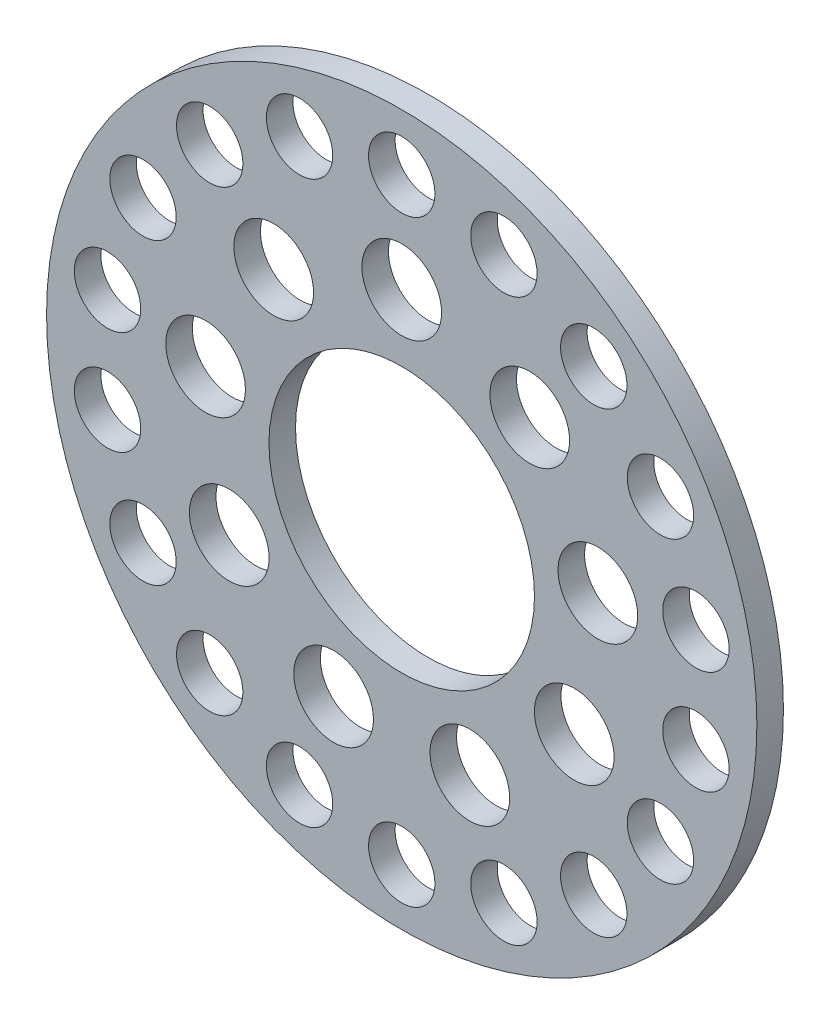
ISO-10303-21;
HEADER;
FILE_DESCRIPTION(('STEP AP214'),'2;1');
FILE_NAME('part.step','',(''),(''),'','','');
FILE_SCHEMA(('AUTOMOTIVE_DESIGN { 1 0 10303 214 1 1 1 1 }'));
ENDSEC;
DATA;
#1=APPLICATION_CONTEXT('core data for automotive mechanical design processes');
#2=APPLICATION_PROTOCOL_DEFINITION('international standard','automotive_design',2000,#1);
#3=PRODUCT_CONTEXT('',#1,'mechanical');
#4=PRODUCT('Part','Part','',(#3));
#5=PRODUCT_RELATED_PRODUCT_CATEGORY('part','',(#4));
#6=PRODUCT_DEFINITION_FORMATION('','',#4);
#7=PRODUCT_DEFINITION_CONTEXT('part definition',#1,'design');
#8=PRODUCT_DEFINITION('design','',#6,#7);
#9=PRODUCT_DEFINITION_SHAPE('','',#8);
#10=(LENGTH_UNIT() NAMED_UNIT(*) SI_UNIT(.MILLI.,.METRE.));
#11=(NAMED_UNIT(*) PLANE_ANGLE_UNIT() SI_UNIT($,.RADIAN.));
#12=(NAMED_UNIT(*) SI_UNIT($,.STERADIAN.) SOLID_ANGLE_UNIT());
#13=UNCERTAINTY_MEASURE_WITH_UNIT(LENGTH_MEASURE(1.E-05),#10,'distance_accuracy_value','');
#14=(GEOMETRIC_REPRESENTATION_CONTEXT(3) GLOBAL_UNCERTAINTY_ASSIGNED_CONTEXT((#13)) GLOBAL_UNIT_ASSIGNED_CONTEXT((#10,
#11,#12)) REPRESENTATION_CONTEXT('',''));
#15=CARTESIAN_POINT('',(0.,0.,0.));
#16=DIRECTION('',(0.,0.,1.));
#17=DIRECTION('',(1.,0.,0.));
#18=AXIS2_PLACEMENT_3D('',#15,#16,#17);
#19=CARTESIAN_POINT('',(0.,0.,2.));
#20=DIRECTION('',(0.,0.,1.));
#21=DIRECTION('',(1.,0.,0.));
#22=AXIS2_PLACEMENT_3D('',#19,#20,#21);
#23=PLANE('',#22);
#24=CARTESIAN_POINT('',(-14.7721162951824,2.60472266500311,2.));
#25=DIRECTION('',(0.,0.,1.));
#26=DIRECTION('',(1.,0.,0.));
#27=AXIS2_PLACEMENT_3D('',#24,#25,#26);
#28=CIRCLE('',#27,3.);
#29=CARTESIAN_POINT('',(-11.7721162951824,2.60472266500311,2.));
#30=VERTEX_POINT('',#29);
#31=EDGE_CURVE('E197',#30,#30,#28,.T.);
#32=ORIENTED_EDGE('',*,*,#31,.F.);
#33=EDGE_LOOP('',(#32));
#34=FACE_BOUND('',#33,.T.);
#35=CARTESIAN_POINT('',(-5.13030214988338,-14.0953893117889,2.));
#36=DIRECTION('',(0.,0.,1.));
#37=DIRECTION('',(1.,0.,0.));
#38=AXIS2_PLACEMENT_3D('',#35,#36,#37);
#39=CIRCLE('',#38,3.);
#40=CARTESIAN_POINT('',(-2.13030214988338,-14.0953893117889,2.));
#41=VERTEX_POINT('',#40);
#42=EDGE_CURVE('E185',#41,#41,#39,.T.);
#43=ORIENTED_EDGE('',*,*,#42,.F.);
#44=EDGE_LOOP('',(#43));
#45=FACE_BOUND('',#44,.T.);
#46=CARTESIAN_POINT('',(12.9903810567679,-7.49999999999926,2.));
#47=DIRECTION('',(0.,0.,1.));
#48=DIRECTION('',(1.,0.,0.));
#49=AXIS2_PLACEMENT_3D('',#46,#47,#48);
#50=CIRCLE('',#49,3.);
#51=CARTESIAN_POINT('',(15.9903810567679,-7.49999999999926,2.));
#52=VERTEX_POINT('',#51);
#53=EDGE_CURVE('E173',#52,#52,#50,.T.);
#54=ORIENTED_EDGE('',*,*,#53,.F.);
#55=EDGE_LOOP('',(#54));
#56=FACE_BOUND('',#55,.T.);
#57=CARTESIAN_POINT('',(9.64181414529811,11.4906666467847,2.));
#58=DIRECTION('',(0.,0.,1.));
#59=DIRECTION('',(1.,0.,0.));
#60=AXIS2_PLACEMENT_3D('',#57,#58,#59);
#61=CIRCLE('',#60,3.);
#62=CARTESIAN_POINT('',(12.6418141452981,11.4906666467847,2.));
#63=VERTEX_POINT('',#62);
#64=EDGE_CURVE('E161',#63,#63,#61,.T.);
#65=ORIENTED_EDGE('',*,*,#64,.F.);
#66=EDGE_LOOP('',(#65));
#67=FACE_BOUND('',#66,.T.);
#68=CARTESIAN_POINT('',(-14.4627212179467,17.2359999701758,2.));
#69=DIRECTION('',(0.,0.,1.));
#70=DIRECTION('',(1.,0.,0.));
#71=AXIS2_PLACEMENT_3D('',#68,#69,#70);
#72=CIRCLE('',#71,2.50000000000106);
#73=CARTESIAN_POINT('',(-11.9627212179456,17.2359999701758,2.));
#74=VERTEX_POINT('',#73);
#75=EDGE_CURVE('E149',#74,#74,#72,.T.);
#76=ORIENTED_EDGE('',*,*,#75,.F.);
#77=EDGE_LOOP('',(#76));
#78=FACE_BOUND('',#77,.T.);
#79=CARTESIAN_POINT('',(-22.1581744427731,3.90708399750404,2.));
#80=DIRECTION('',(0.,0.,1.));
#81=DIRECTION('',(1.,0.,0.));
#82=AXIS2_PLACEMENT_3D('',#79,#80,#81);
#83=CIRCLE('',#82,2.50000000000229);
#84=CARTESIAN_POINT('',(-19.6581744427708,3.90708399750404,2.));
#85=VERTEX_POINT('',#84);
#86=EDGE_CURVE('E137',#85,#85,#83,.T.);
#87=ORIENTED_EDGE('',*,*,#86,.F.);
#88=EDGE_LOOP('',(#87));
#89=FACE_BOUND('',#88,.T.);
#90=CARTESIAN_POINT('',(-19.485571585147,-11.2500000000017,2.));
#91=DIRECTION('',(0.,0.,1.));
#92=DIRECTION('',(1.,0.,0.));
#93=AXIS2_PLACEMENT_3D('',#90,#91,#92);
#94=CIRCLE('',#93,2.50000000000345);
#95=CARTESIAN_POINT('',(-16.9855715851435,-11.2500000000017,2.));
#96=VERTEX_POINT('',#95);
#97=EDGE_CURVE('E125',#96,#96,#94,.T.);
#98=ORIENTED_EDGE('',*,*,#97,.F.);
#99=EDGE_LOOP('',(#98));
#100=FACE_BOUND('',#99,.T.);
#101=CARTESIAN_POINT('',(-7.69545322482383,-21.1430839676836,2.));
#102=DIRECTION('',(0.,0.,1.));
#103=DIRECTION('',(1.,0.,0.));
#104=AXIS2_PLACEMENT_3D('',#101,#102,#103);
#105=CIRCLE('',#104,2.50000000000391);
#106=CARTESIAN_POINT('',(-5.19545322481992,-21.1430839676836,2.));
#107=VERTEX_POINT('',#106);
#108=EDGE_CURVE('E113',#107,#107,#105,.T.);
#109=ORIENTED_EDGE('',*,*,#108,.F.);
#110=EDGE_LOOP('',(#109));
#111=FACE_BOUND('',#110,.T.);
#112=CARTESIAN_POINT('',(7.69545322483126,-21.1430839676823,2.));
#113=DIRECTION('',(0.,0.,1.));
#114=DIRECTION('',(1.,0.,0.));
#115=AXIS2_PLACEMENT_3D('',#112,#113,#114);
#116=CIRCLE('',#115,2.50000000000349);
#117=CARTESIAN_POINT('',(10.1954532248348,-21.1430839676823,2.));
#118=VERTEX_POINT('',#117);
#119=EDGE_CURVE('E101',#118,#118,#116,.T.);
#120=ORIENTED_EDGE('',*,*,#119,.F.);
#121=EDGE_LOOP('',(#120));
#122=FACE_BOUND('',#121,.T.);
#123=CARTESIAN_POINT('',(19.4855715851527,-11.2499999999983,2.));
#124=DIRECTION('',(0.,0.,1.));
#125=DIRECTION('',(1.,0.,0.));
#126=AXIS2_PLACEMENT_3D('',#123,#124,#125);
#127=CIRCLE('',#126,2.50000000000237);
#128=CARTESIAN_POINT('',(21.9855715851551,-11.2499999999983,2.));
#129=VERTEX_POINT('',#128);
#130=EDGE_CURVE('E89',#129,#129,#127,.T.);
#131=ORIENTED_EDGE('',*,*,#130,.F.);
#132=EDGE_LOOP('',(#131));
#133=FACE_BOUND('',#132,.T.);
#134=CARTESIAN_POINT('',(22.1581744427763,3.90708399750782,2.));
#135=DIRECTION('',(0.,0.,1.));
#136=DIRECTION('',(1.,0.,0.));
#137=AXIS2_PLACEMENT_3D('',#134,#135,#136);
#138=CIRCLE('',#137,2.50000000000103);
#139=CARTESIAN_POINT('',(24.6581744427773,3.90708399750782,2.));
#140=VERTEX_POINT('',#139);
#141=EDGE_CURVE('E77',#140,#140,#138,.T.);
#142=ORIENTED_EDGE('',*,*,#141,.F.);
#143=EDGE_LOOP('',(#142));
#144=FACE_BOUND('',#143,.T.);
#145=CARTESIAN_POINT('',(14.4627212179476,17.2359999701782,2.));
#146=DIRECTION('',(0.,0.,1.));
#147=DIRECTION('',(1.,0.,0.));
#148=AXIS2_PLACEMENT_3D('',#145,#146,#147);
#149=CIRCLE('',#148,2.5000000000001);
#150=CARTESIAN_POINT('',(16.9627212179477,17.2359999701782,2.));
#151=VERTEX_POINT('',#150);
#152=EDGE_CURVE('E65',#151,#151,#149,.T.);
#153=ORIENTED_EDGE('',*,*,#152,.F.);
#154=EDGE_LOOP('',(#153));
#155=FACE_BOUND('',#154,.T.);
#156=CARTESIAN_POINT('',(0.,15.,2.));
#157=DIRECTION('',(0.,0.,1.));
#158=DIRECTION('',(1.,0.,0.));
#159=AXIS2_PLACEMENT_3D('',#156,#157,#158);
#160=CIRCLE('',#159,3.);
#161=CARTESIAN_POINT('',(3.,15.,2.));
#162=VERTEX_POINT('',#161);
#163=EDGE_CURVE('E53',#162,#162,#160,.T.);
#164=ORIENTED_EDGE('',*,*,#163,.F.);
#165=EDGE_LOOP('',(#164));
#166=FACE_BOUND('',#165,.T.);
#167=CARTESIAN_POINT('',(0.,0.,2.));
#168=DIRECTION('',(0.,0.,1.));
#169=DIRECTION('',(1.,0.,0.));
#170=AXIS2_PLACEMENT_3D('',#167,#168,#169);
#171=CIRCLE('',#170,10.);
#172=CARTESIAN_POINT('',(10.,0.,2.));
#173=VERTEX_POINT('',#172);
#174=EDGE_CURVE('E42',#173,#173,#171,.T.);
#175=ORIENTED_EDGE('',*,*,#174,.F.);
#176=EDGE_LOOP('',(#175));
#177=FACE_BOUND('',#176,.T.);
#178=CARTESIAN_POINT('',(0.,0.,2.));
#179=DIRECTION('',(0.,0.,1.));
#180=DIRECTION('',(1.,0.,0.));
#181=AXIS2_PLACEMENT_3D('',#178,#179,#180);
#182=CIRCLE('',#181,26.75);
#183=CARTESIAN_POINT('',(26.75,0.,2.));
#184=VERTEX_POINT('',#183);
#185=EDGE_CURVE('E10',#184,#184,#182,.T.);
#186=ORIENTED_EDGE('',*,*,#185,.T.);
#187=EDGE_LOOP('',(#186));
#188=FACE_BOUND('',#187,.T.);
#189=CARTESIAN_POINT('',(0.,22.5,2.));
#190=DIRECTION('',(0.,0.,1.));
#191=DIRECTION('',(1.,0.,0.));
#192=AXIS2_PLACEMENT_3D('',#189,#190,#191);
#193=CIRCLE('',#192,2.5);
#194=CARTESIAN_POINT('',(2.5,22.5,2.));
#195=VERTEX_POINT('',#194);
#196=EDGE_CURVE('E47',#195,#195,#193,.T.);
#197=ORIENTED_EDGE('',*,*,#196,.F.);
#198=EDGE_LOOP('',(#197));
#199=FACE_BOUND('',#198,.T.);
#200=CARTESIAN_POINT('',(7.69545322482765,21.1430839676836,2.));
#201=DIRECTION('',(0.,0.,1.));
#202=DIRECTION('',(1.,0.,0.));
#203=AXIS2_PLACEMENT_3D('',#200,#201,#202);
#204=CIRCLE('',#203,2.49999999999995);
#205=CARTESIAN_POINT('',(10.1954532248276,21.1430839676836,2.));
#206=VERTEX_POINT('',#205);
#207=EDGE_CURVE('E59',#206,#206,#204,.T.);
#208=ORIENTED_EDGE('',*,*,#207,.F.);
#209=EDGE_LOOP('',(#208));
#210=FACE_BOUND('',#209,.T.);
#211=CARTESIAN_POINT('',(19.4855715851508,11.2500000000017,2.));
#212=DIRECTION('',(0.,0.,1.));
#213=DIRECTION('',(1.,0.,0.));
#214=AXIS2_PLACEMENT_3D('',#211,#212,#213);
#215=CIRCLE('',#214,2.50000000000048);
#216=CARTESIAN_POINT('',(21.9855715851513,11.2500000000017,2.));
#217=VERTEX_POINT('',#216);
#218=EDGE_CURVE('E71',#217,#217,#215,.T.);
#219=ORIENTED_EDGE('',*,*,#218,.F.);
#220=EDGE_LOOP('',(#219));
#221=FACE_BOUND('',#220,.T.);
#222=CARTESIAN_POINT('',(22.1581744427769,-3.90708399750405,2.));
#223=DIRECTION('',(0.,0.,1.));
#224=DIRECTION('',(1.,0.,0.));
#225=AXIS2_PLACEMENT_3D('',#222,#223,#224);
#226=CIRCLE('',#225,2.50000000000168);
#227=CARTESIAN_POINT('',(24.6581744427786,-3.90708399750405,2.));
#228=VERTEX_POINT('',#227);
#229=EDGE_CURVE('E83',#228,#228,#226,.T.);
#230=ORIENTED_EDGE('',*,*,#229,.F.);
#231=EDGE_LOOP('',(#230));
#232=FACE_BOUND('',#231,.T.);
#233=CARTESIAN_POINT('',(14.4627212179505,-17.2359999701758,2.));
#234=DIRECTION('',(0.,0.,1.));
#235=DIRECTION('',(1.,0.,0.));
#236=AXIS2_PLACEMENT_3D('',#233,#234,#235);
#237=CIRCLE('',#236,2.50000000000299);
#238=CARTESIAN_POINT('',(16.9627212179535,-17.2359999701758,2.));
#239=VERTEX_POINT('',#238);
#240=EDGE_CURVE('E95',#239,#239,#237,.T.);
#241=ORIENTED_EDGE('',*,*,#240,.F.);
#242=EDGE_LOOP('',(#241));
#243=FACE_BOUND('',#242,.T.);
#244=CARTESIAN_POINT('',(3.83141986250838E-12,-22.5,2.));
#245=DIRECTION('',(0.,0.,1.));
#246=DIRECTION('',(1.,0.,0.));
#247=AXIS2_PLACEMENT_3D('',#244,#245,#246);
#248=CIRCLE('',#247,2.50000000000381);
#249=CARTESIAN_POINT('',(2.50000000000765,-22.5,2.));
#250=VERTEX_POINT('',#249);
#251=EDGE_CURVE('E107',#250,#250,#248,.T.);
#252=ORIENTED_EDGE('',*,*,#251,.F.);
#253=EDGE_LOOP('',(#252));
#254=FACE_BOUND('',#253,.T.);
#255=CARTESIAN_POINT('',(-14.4627212179438,-17.2359999701782,2.));
#256=DIRECTION('',(0.,0.,1.));
#257=DIRECTION('',(1.,0.,0.));
#258=AXIS2_PLACEMENT_3D('',#255,#256,#257);
#259=CIRCLE('',#258,2.50000000000377);
#260=CARTESIAN_POINT('',(-11.96272121794,-17.2359999701782,2.));
#261=VERTEX_POINT('',#260);
#262=EDGE_CURVE('E119',#261,#261,#259,.T.);
#263=ORIENTED_EDGE('',*,*,#262,.F.);
#264=EDGE_LOOP('',(#263));
#265=FACE_BOUND('',#264,.T.);
#266=CARTESIAN_POINT('',(-22.1581744427724,-3.90708399750782,2.));
#267=DIRECTION('',(0.,0.,1.));
#268=DIRECTION('',(1.,0.,0.));
#269=AXIS2_PLACEMENT_3D('',#266,#267,#268);
#270=CIRCLE('',#269,2.50000000000291);
#271=CARTESIAN_POINT('',(-19.6581744427695,-3.90708399750782,2.));
#272=VERTEX_POINT('',#271);
#273=EDGE_CURVE('E131',#272,#272,#270,.T.);
#274=ORIENTED_EDGE('',*,*,#273,.F.);
#275=EDGE_LOOP('',(#274));
#276=FACE_BOUND('',#275,.T.);
#277=CARTESIAN_POINT('',(-19.4855715851489,11.2499999999983,2.));
#278=DIRECTION('',(0.,0.,1.));
#279=DIRECTION('',(1.,0.,0.));
#280=AXIS2_PLACEMENT_3D('',#277,#278,#279);
#281=CIRCLE('',#280,2.50000000000165);
#282=CARTESIAN_POINT('',(-16.9855715851473,11.2499999999983,2.));
#283=VERTEX_POINT('',#282);
#284=EDGE_CURVE('E143',#283,#283,#281,.T.);
#285=ORIENTED_EDGE('',*,*,#284,.F.);
#286=EDGE_LOOP('',(#285));
#287=FACE_BOUND('',#286,.T.);
#288=CARTESIAN_POINT('',(-7.69545322482745,21.1430839676823,2.));
#289=DIRECTION('',(0.,0.,1.));
#290=DIRECTION('',(1.,0.,0.));
#291=AXIS2_PLACEMENT_3D('',#288,#289,#290);
#292=CIRCLE('',#291,2.50000000000059);
#293=CARTESIAN_POINT('',(-5.19545322482686,21.1430839676823,2.));
#294=VERTEX_POINT('',#293);
#295=EDGE_CURVE('E155',#294,#294,#292,.T.);
#296=ORIENTED_EDGE('',*,*,#295,.F.);
#297=EDGE_LOOP('',(#296));
#298=FACE_BOUND('',#297,.T.);
#299=CARTESIAN_POINT('',(14.7721162951838,2.60472266500479,2.));
#300=DIRECTION('',(0.,0.,1.));
#301=DIRECTION('',(1.,0.,0.));
#302=AXIS2_PLACEMENT_3D('',#299,#300,#301);
#303=CIRCLE('',#302,3.);
#304=CARTESIAN_POINT('',(17.7721162951838,2.60472266500479,2.));
#305=VERTEX_POINT('',#304);
#306=EDGE_CURVE('E167',#305,#305,#303,.T.);
#307=ORIENTED_EDGE('',*,*,#306,.F.);
#308=EDGE_LOOP('',(#307));
#309=FACE_BOUND('',#308,.T.);
#310=CARTESIAN_POINT('',(5.13030214988668,-14.0953893117883,2.));
#311=DIRECTION('',(0.,0.,1.));
#312=DIRECTION('',(1.,0.,0.));
#313=AXIS2_PLACEMENT_3D('',#310,#311,#312);
#314=CIRCLE('',#313,3.);
#315=CARTESIAN_POINT('',(8.13030214988668,-14.0953893117883,2.));
#316=VERTEX_POINT('',#315);
#317=EDGE_CURVE('E179',#316,#316,#314,.T.);
#318=ORIENTED_EDGE('',*,*,#317,.F.);
#319=EDGE_LOOP('',(#318));
#320=FACE_BOUND('',#319,.T.);
#321=CARTESIAN_POINT('',(-12.9903810567653,-7.50000000000074,2.));
#322=DIRECTION('',(0.,0.,1.));
#323=DIRECTION('',(1.,0.,0.));
#324=AXIS2_PLACEMENT_3D('',#321,#322,#323);
#325=CIRCLE('',#324,3.);
#326=CARTESIAN_POINT('',(-9.9903810567653,-7.50000000000074,2.));
#327=VERTEX_POINT('',#326);
#328=EDGE_CURVE('E191',#327,#327,#325,.T.);
#329=ORIENTED_EDGE('',*,*,#328,.F.);
#330=EDGE_LOOP('',(#329));
#331=FACE_BOUND('',#330,.T.);
#332=CARTESIAN_POINT('',(-9.64181414529789,11.4906666467841,2.));
#333=DIRECTION('',(0.,0.,1.));
#334=DIRECTION('',(1.,0.,0.));
#335=AXIS2_PLACEMENT_3D('',#332,#333,#334);
#336=CIRCLE('',#335,3.);
#337=CARTESIAN_POINT('',(-6.64181414529789,11.4906666467841,2.));
#338=VERTEX_POINT('',#337);
#339=EDGE_CURVE('E203',#338,#338,#336,.T.);
#340=ORIENTED_EDGE('',*,*,#339,.F.);
#341=EDGE_LOOP('',(#340));
#342=FACE_BOUND('',#341,.T.);
#343=ADVANCED_FACE('F31',(#34,#45,#56,#67,#78,#89,#100,#111,#122,#133,#144,#155,#166,#177,#188,
#199,#210,#221,#232,#243,#254,#265,#276,#287,#298,#309,#320,#331,#342),#23,.T.);
#344=CARTESIAN_POINT('',(0.,0.,0.));
#345=DIRECTION('',(0.,0.,1.));
#346=DIRECTION('',(1.,0.,0.));
#347=AXIS2_PLACEMENT_3D('',#344,#345,#346);
#348=PLANE('',#347);
#349=CARTESIAN_POINT('',(0.,0.,0.));
#350=DIRECTION('',(0.,0.,1.));
#351=DIRECTION('',(1.,0.,0.));
#352=AXIS2_PLACEMENT_3D('',#349,#350,#351);
#353=CIRCLE('',#352,26.75);
#354=CARTESIAN_POINT('',(26.75,0.,0.));
#355=VERTEX_POINT('',#354);
#356=EDGE_CURVE('E35',#355,#355,#353,.T.);
#357=ORIENTED_EDGE('',*,*,#356,.F.);
#358=EDGE_LOOP('',(#357));
#359=FACE_BOUND('',#358,.T.);
#360=CARTESIAN_POINT('',(0.,0.,0.));
#361=DIRECTION('',(0.,0.,1.));
#362=DIRECTION('',(1.,0.,0.));
#363=AXIS2_PLACEMENT_3D('',#360,#361,#362);
#364=CIRCLE('',#363,10.);
#365=CARTESIAN_POINT('',(10.,0.,0.));
#366=VERTEX_POINT('',#365);
#367=EDGE_CURVE('E44',#366,#366,#364,.T.);
#368=ORIENTED_EDGE('',*,*,#367,.T.);
#369=EDGE_LOOP('',(#368));
#370=FACE_BOUND('',#369,.T.);
#371=CARTESIAN_POINT('',(0.,22.5,0.));
#372=DIRECTION('',(0.,0.,1.));
#373=DIRECTION('',(1.,0.,0.));
#374=AXIS2_PLACEMENT_3D('',#371,#372,#373);
#375=CIRCLE('',#374,2.5);
#376=CARTESIAN_POINT('',(2.5,22.5,0.));
#377=VERTEX_POINT('',#376);
#378=EDGE_CURVE('E50',#377,#377,#375,.T.);
#379=ORIENTED_EDGE('',*,*,#378,.T.);
#380=EDGE_LOOP('',(#379));
#381=FACE_BOUND('',#380,.T.);
#382=CARTESIAN_POINT('',(0.,15.,0.));
#383=DIRECTION('',(0.,0.,1.));
#384=DIRECTION('',(1.,0.,0.));
#385=AXIS2_PLACEMENT_3D('',#382,#383,#384);
#386=CIRCLE('',#385,3.);
#387=CARTESIAN_POINT('',(3.,15.,0.));
#388=VERTEX_POINT('',#387);
#389=EDGE_CURVE('E56',#388,#388,#386,.T.);
#390=ORIENTED_EDGE('',*,*,#389,.T.);
#391=EDGE_LOOP('',(#390));
#392=FACE_BOUND('',#391,.T.);
#393=CARTESIAN_POINT('',(7.69545322482765,21.1430839676836,0.));
#394=DIRECTION('',(0.,0.,1.));
#395=DIRECTION('',(1.,0.,0.));
#396=AXIS2_PLACEMENT_3D('',#393,#394,#395);
#397=CIRCLE('',#396,2.49999999999995);
#398=CARTESIAN_POINT('',(10.1954532248276,21.1430839676836,0.));
#399=VERTEX_POINT('',#398);
#400=EDGE_CURVE('E62',#399,#399,#397,.T.);
#401=ORIENTED_EDGE('',*,*,#400,.T.);
#402=EDGE_LOOP('',(#401));
#403=FACE_BOUND('',#402,.T.);
#404=CARTESIAN_POINT('',(14.4627212179476,17.2359999701782,0.));
#405=DIRECTION('',(0.,0.,1.));
#406=DIRECTION('',(1.,0.,0.));
#407=AXIS2_PLACEMENT_3D('',#404,#405,#406);
#408=CIRCLE('',#407,2.5000000000001);
#409=CARTESIAN_POINT('',(16.9627212179477,17.2359999701782,0.));
#410=VERTEX_POINT('',#409);
#411=EDGE_CURVE('E68',#410,#410,#408,.T.);
#412=ORIENTED_EDGE('',*,*,#411,.T.);
#413=EDGE_LOOP('',(#412));
#414=FACE_BOUND('',#413,.T.);
#415=CARTESIAN_POINT('',(19.4855715851508,11.2500000000017,0.));
#416=DIRECTION('',(0.,0.,1.));
#417=DIRECTION('',(1.,0.,0.));
#418=AXIS2_PLACEMENT_3D('',#415,#416,#417);
#419=CIRCLE('',#418,2.50000000000048);
#420=CARTESIAN_POINT('',(21.9855715851513,11.2500000000017,0.));
#421=VERTEX_POINT('',#420);
#422=EDGE_CURVE('E74',#421,#421,#419,.T.);
#423=ORIENTED_EDGE('',*,*,#422,.T.);
#424=EDGE_LOOP('',(#423));
#425=FACE_BOUND('',#424,.T.);
#426=CARTESIAN_POINT('',(22.1581744427763,3.90708399750782,0.));
#427=DIRECTION('',(0.,0.,1.));
#428=DIRECTION('',(1.,0.,0.));
#429=AXIS2_PLACEMENT_3D('',#426,#427,#428);
#430=CIRCLE('',#429,2.50000000000103);
#431=CARTESIAN_POINT('',(24.6581744427773,3.90708399750782,0.));
#432=VERTEX_POINT('',#431);
#433=EDGE_CURVE('E80',#432,#432,#430,.T.);
#434=ORIENTED_EDGE('',*,*,#433,.T.);
#435=EDGE_LOOP('',(#434));
#436=FACE_BOUND('',#435,.T.);
#437=CARTESIAN_POINT('',(22.1581744427769,-3.90708399750405,0.));
#438=DIRECTION('',(0.,0.,1.));
#439=DIRECTION('',(1.,0.,0.));
#440=AXIS2_PLACEMENT_3D('',#437,#438,#439);
#441=CIRCLE('',#440,2.50000000000168);
#442=CARTESIAN_POINT('',(24.6581744427786,-3.90708399750405,0.));
#443=VERTEX_POINT('',#442);
#444=EDGE_CURVE('E86',#443,#443,#441,.T.);
#445=ORIENTED_EDGE('',*,*,#444,.T.);
#446=EDGE_LOOP('',(#445));
#447=FACE_BOUND('',#446,.T.);
#448=CARTESIAN_POINT('',(19.4855715851527,-11.2499999999983,0.));
#449=DIRECTION('',(0.,0.,1.));
#450=DIRECTION('',(1.,0.,0.));
#451=AXIS2_PLACEMENT_3D('',#448,#449,#450);
#452=CIRCLE('',#451,2.50000000000237);
#453=CARTESIAN_POINT('',(21.9855715851551,-11.2499999999983,0.));
#454=VERTEX_POINT('',#453);
#455=EDGE_CURVE('E92',#454,#454,#452,.T.);
#456=ORIENTED_EDGE('',*,*,#455,.T.);
#457=EDGE_LOOP('',(#456));
#458=FACE_BOUND('',#457,.T.);
#459=CARTESIAN_POINT('',(14.4627212179505,-17.2359999701758,0.));
#460=DIRECTION('',(0.,0.,1.));
#461=DIRECTION('',(1.,0.,0.));
#462=AXIS2_PLACEMENT_3D('',#459,#460,#461);
#463=CIRCLE('',#462,2.50000000000299);
#464=CARTESIAN_POINT('',(16.9627212179535,-17.2359999701758,0.));
#465=VERTEX_POINT('',#464);
#466=EDGE_CURVE('E98',#465,#465,#463,.T.);
#467=ORIENTED_EDGE('',*,*,#466,.T.);
#468=EDGE_LOOP('',(#467));
#469=FACE_BOUND('',#468,.T.);
#470=CARTESIAN_POINT('',(7.69545322483126,-21.1430839676823,0.));
#471=DIRECTION('',(0.,0.,1.));
#472=DIRECTION('',(1.,0.,0.));
#473=AXIS2_PLACEMENT_3D('',#470,#471,#472);
#474=CIRCLE('',#473,2.50000000000349);
#475=CARTESIAN_POINT('',(10.1954532248348,-21.1430839676823,0.));
#476=VERTEX_POINT('',#475);
#477=EDGE_CURVE('E104',#476,#476,#474,.T.);
#478=ORIENTED_EDGE('',*,*,#477,.T.);
#479=EDGE_LOOP('',(#478));
#480=FACE_BOUND('',#479,.T.);
#481=CARTESIAN_POINT('',(3.83141986250838E-12,-22.5,0.));
#482=DIRECTION('',(0.,0.,1.));
#483=DIRECTION('',(1.,0.,0.));
#484=AXIS2_PLACEMENT_3D('',#481,#482,#483);
#485=CIRCLE('',#484,2.50000000000381);
#486=CARTESIAN_POINT('',(2.50000000000765,-22.5,0.));
#487=VERTEX_POINT('',#486);
#488=EDGE_CURVE('E110',#487,#487,#485,.T.);
#489=ORIENTED_EDGE('',*,*,#488,.T.);
#490=EDGE_LOOP('',(#489));
#491=FACE_BOUND('',#490,.T.);
#492=CARTESIAN_POINT('',(-7.69545322482383,-21.1430839676836,0.));
#493=DIRECTION('',(0.,0.,1.));
#494=DIRECTION('',(1.,0.,0.));
#495=AXIS2_PLACEMENT_3D('',#492,#493,#494);
#496=CIRCLE('',#495,2.50000000000391);
#497=CARTESIAN_POINT('',(-5.19545322481992,-21.1430839676836,0.));
#498=VERTEX_POINT('',#497);
#499=EDGE_CURVE('E116',#498,#498,#496,.T.);
#500=ORIENTED_EDGE('',*,*,#499,.T.);
#501=EDGE_LOOP('',(#500));
#502=FACE_BOUND('',#501,.T.);
#503=CARTESIAN_POINT('',(-14.4627212179438,-17.2359999701782,0.));
#504=DIRECTION('',(0.,0.,1.));
#505=DIRECTION('',(1.,0.,0.));
#506=AXIS2_PLACEMENT_3D('',#503,#504,#505);
#507=CIRCLE('',#506,2.50000000000377);
#508=CARTESIAN_POINT('',(-11.96272121794,-17.2359999701782,0.));
#509=VERTEX_POINT('',#508);
#510=EDGE_CURVE('E122',#509,#509,#507,.T.);
#511=ORIENTED_EDGE('',*,*,#510,.T.);
#512=EDGE_LOOP('',(#511));
#513=FACE_BOUND('',#512,.T.);
#514=CARTESIAN_POINT('',(-19.485571585147,-11.2500000000017,0.));
#515=DIRECTION('',(0.,0.,1.));
#516=DIRECTION('',(1.,0.,0.));
#517=AXIS2_PLACEMENT_3D('',#514,#515,#516);
#518=CIRCLE('',#517,2.50000000000345);
#519=CARTESIAN_POINT('',(-16.9855715851435,-11.2500000000017,0.));
#520=VERTEX_POINT('',#519);
#521=EDGE_CURVE('E128',#520,#520,#518,.T.);
#522=ORIENTED_EDGE('',*,*,#521,.T.);
#523=EDGE_LOOP('',(#522));
#524=FACE_BOUND('',#523,.T.);
#525=CARTESIAN_POINT('',(-22.1581744427724,-3.90708399750782,0.));
#526=DIRECTION('',(0.,0.,1.));
#527=DIRECTION('',(1.,0.,0.));
#528=AXIS2_PLACEMENT_3D('',#525,#526,#527);
#529=CIRCLE('',#528,2.50000000000291);
#530=CARTESIAN_POINT('',(-19.6581744427695,-3.90708399750782,0.));
#531=VERTEX_POINT('',#530);
#532=EDGE_CURVE('E134',#531,#531,#529,.T.);
#533=ORIENTED_EDGE('',*,*,#532,.T.);
#534=EDGE_LOOP('',(#533));
#535=FACE_BOUND('',#534,.T.);
#536=CARTESIAN_POINT('',(-22.1581744427731,3.90708399750404,0.));
#537=DIRECTION('',(0.,0.,1.));
#538=DIRECTION('',(1.,0.,0.));
#539=AXIS2_PLACEMENT_3D('',#536,#537,#538);
#540=CIRCLE('',#539,2.50000000000229);
#541=CARTESIAN_POINT('',(-19.6581744427708,3.90708399750404,0.));
#542=VERTEX_POINT('',#541);
#543=EDGE_CURVE('E140',#542,#542,#540,.T.);
#544=ORIENTED_EDGE('',*,*,#543,.T.);
#545=EDGE_LOOP('',(#544));
#546=FACE_BOUND('',#545,.T.);
#547=CARTESIAN_POINT('',(-19.4855715851489,11.2499999999983,0.));
#548=DIRECTION('',(0.,0.,1.));
#549=DIRECTION('',(1.,0.,0.));
#550=AXIS2_PLACEMENT_3D('',#547,#548,#549);
#551=CIRCLE('',#550,2.50000000000165);
#552=CARTESIAN_POINT('',(-16.9855715851473,11.2499999999983,0.));
#553=VERTEX_POINT('',#552);
#554=EDGE_CURVE('E146',#553,#553,#551,.T.);
#555=ORIENTED_EDGE('',*,*,#554,.T.);
#556=EDGE_LOOP('',(#555));
#557=FACE_BOUND('',#556,.T.);
#558=CARTESIAN_POINT('',(-14.4627212179467,17.2359999701758,0.));
#559=DIRECTION('',(0.,0.,1.));
#560=DIRECTION('',(1.,0.,0.));
#561=AXIS2_PLACEMENT_3D('',#558,#559,#560);
#562=CIRCLE('',#561,2.50000000000106);
#563=CARTESIAN_POINT('',(-11.9627212179456,17.2359999701758,0.));
#564=VERTEX_POINT('',#563);
#565=EDGE_CURVE('E152',#564,#564,#562,.T.);
#566=ORIENTED_EDGE('',*,*,#565,.T.);
#567=EDGE_LOOP('',(#566));
#568=FACE_BOUND('',#567,.T.);
#569=CARTESIAN_POINT('',(-7.69545322482745,21.1430839676823,0.));
#570=DIRECTION('',(0.,0.,1.));
#571=DIRECTION('',(1.,0.,0.));
#572=AXIS2_PLACEMENT_3D('',#569,#570,#571);
#573=CIRCLE('',#572,2.50000000000059);
#574=CARTESIAN_POINT('',(-5.19545322482686,21.1430839676823,0.));
#575=VERTEX_POINT('',#574);
#576=EDGE_CURVE('E158',#575,#575,#573,.T.);
#577=ORIENTED_EDGE('',*,*,#576,.T.);
#578=EDGE_LOOP('',(#577));
#579=FACE_BOUND('',#578,.T.);
#580=CARTESIAN_POINT('',(9.64181414529811,11.4906666467847,0.));
#581=DIRECTION('',(0.,0.,1.));
#582=DIRECTION('',(1.,0.,0.));
#583=AXIS2_PLACEMENT_3D('',#580,#581,#582);
#584=CIRCLE('',#583,3.);
#585=CARTESIAN_POINT('',(12.6418141452981,11.4906666467847,0.));
#586=VERTEX_POINT('',#585);
#587=EDGE_CURVE('E164',#586,#586,#584,.T.);
#588=ORIENTED_EDGE('',*,*,#587,.T.);
#589=EDGE_LOOP('',(#588));
#590=FACE_BOUND('',#589,.T.);
#591=CARTESIAN_POINT('',(14.7721162951838,2.60472266500479,0.));
#592=DIRECTION('',(0.,0.,1.));
#593=DIRECTION('',(1.,0.,0.));
#594=AXIS2_PLACEMENT_3D('',#591,#592,#593);
#595=CIRCLE('',#594,3.);
#596=CARTESIAN_POINT('',(17.7721162951838,2.60472266500479,0.));
#597=VERTEX_POINT('',#596);
#598=EDGE_CURVE('E170',#597,#597,#595,.T.);
#599=ORIENTED_EDGE('',*,*,#598,.T.);
#600=EDGE_LOOP('',(#599));
#601=FACE_BOUND('',#600,.T.);
#602=CARTESIAN_POINT('',(12.9903810567679,-7.49999999999926,0.));
#603=DIRECTION('',(0.,0.,1.));
#604=DIRECTION('',(1.,0.,0.));
#605=AXIS2_PLACEMENT_3D('',#602,#603,#604);
#606=CIRCLE('',#605,3.);
#607=CARTESIAN_POINT('',(15.9903810567679,-7.49999999999926,0.));
#608=VERTEX_POINT('',#607);
#609=EDGE_CURVE('E176',#608,#608,#606,.T.);
#610=ORIENTED_EDGE('',*,*,#609,.T.);
#611=EDGE_LOOP('',(#610));
#612=FACE_BOUND('',#611,.T.);
#613=CARTESIAN_POINT('',(5.13030214988668,-14.0953893117883,0.));
#614=DIRECTION('',(0.,0.,1.));
#615=DIRECTION('',(1.,0.,0.));
#616=AXIS2_PLACEMENT_3D('',#613,#614,#615);
#617=CIRCLE('',#616,3.);
#618=CARTESIAN_POINT('',(8.13030214988668,-14.0953893117883,0.));
#619=VERTEX_POINT('',#618);
#620=EDGE_CURVE('E182',#619,#619,#617,.T.);
#621=ORIENTED_EDGE('',*,*,#620,.T.);
#622=EDGE_LOOP('',(#621));
#623=FACE_BOUND('',#622,.T.);
#624=CARTESIAN_POINT('',(-5.13030214988338,-14.0953893117889,0.));
#625=DIRECTION('',(0.,0.,1.));
#626=DIRECTION('',(1.,0.,0.));
#627=AXIS2_PLACEMENT_3D('',#624,#625,#626);
#628=CIRCLE('',#627,3.);
#629=CARTESIAN_POINT('',(-2.13030214988338,-14.0953893117889,0.));
#630=VERTEX_POINT('',#629);
#631=EDGE_CURVE('E188',#630,#630,#628,.T.);
#632=ORIENTED_EDGE('',*,*,#631,.T.);
#633=EDGE_LOOP('',(#632));
#634=FACE_BOUND('',#633,.T.);
#635=CARTESIAN_POINT('',(-12.9903810567653,-7.50000000000074,0.));
#636=DIRECTION('',(0.,0.,1.));
#637=DIRECTION('',(1.,0.,0.));
#638=AXIS2_PLACEMENT_3D('',#635,#636,#637);
#639=CIRCLE('',#638,3.);
#640=CARTESIAN_POINT('',(-9.9903810567653,-7.50000000000074,0.));
#641=VERTEX_POINT('',#640);
#642=EDGE_CURVE('E194',#641,#641,#639,.T.);
#643=ORIENTED_EDGE('',*,*,#642,.T.);
#644=EDGE_LOOP('',(#643));
#645=FACE_BOUND('',#644,.T.);
#646=CARTESIAN_POINT('',(-14.7721162951824,2.60472266500311,0.));
#647=DIRECTION('',(0.,0.,1.));
#648=DIRECTION('',(1.,0.,0.));
#649=AXIS2_PLACEMENT_3D('',#646,#647,#648);
#650=CIRCLE('',#649,3.);
#651=CARTESIAN_POINT('',(-11.7721162951824,2.60472266500311,0.));
#652=VERTEX_POINT('',#651);
#653=EDGE_CURVE('E200',#652,#652,#650,.T.);
#654=ORIENTED_EDGE('',*,*,#653,.T.);
#655=EDGE_LOOP('',(#654));
#656=FACE_BOUND('',#655,.T.);
#657=CARTESIAN_POINT('',(-9.64181414529789,11.4906666467841,0.));
#658=DIRECTION('',(0.,0.,1.));
#659=DIRECTION('',(1.,0.,0.));
#660=AXIS2_PLACEMENT_3D('',#657,#658,#659);
#661=CIRCLE('',#660,3.);
#662=CARTESIAN_POINT('',(-6.64181414529789,11.4906666467841,0.));
#663=VERTEX_POINT('',#662);
#664=EDGE_CURVE('E206',#663,#663,#661,.T.);
#665=ORIENTED_EDGE('',*,*,#664,.T.);
#666=EDGE_LOOP('',(#665));
#667=FACE_BOUND('',#666,.T.);
#668=ADVANCED_FACE('F216',(#359,#370,#381,#392,#403,#414,#425,#436,#447,#458,#469,#480,#491,
#502,#513,#524,#535,#546,#557,#568,#579,#590,#601,#612,#623,#634,#645,#656,#667),#348,.F.);
#669=CARTESIAN_POINT('',(0.,0.,2.));
#670=DIRECTION('',(0.,0.,-1.));
#671=DIRECTION('',(-1.,0.,0.));
#672=AXIS2_PLACEMENT_3D('',#669,#670,#671);
#673=CYLINDRICAL_SURFACE('',#672,26.75);
#674=ORIENTED_EDGE('',*,*,#185,.F.);
#675=EDGE_LOOP('',(#674));
#676=FACE_BOUND('',#675,.T.);
#677=ORIENTED_EDGE('',*,*,#356,.T.);
#678=EDGE_LOOP('',(#677));
#679=FACE_BOUND('',#678,.T.);
#680=ADVANCED_FACE('F33',(#676,#679),#673,.T.);
#681=CARTESIAN_POINT('',(0.,0.,2.));
#682=DIRECTION('',(0.,0.,-1.));
#683=DIRECTION('',(-1.,0.,0.));
#684=AXIS2_PLACEMENT_3D('',#681,#682,#683);
#685=CYLINDRICAL_SURFACE('',#684,10.);
#686=ORIENTED_EDGE('',*,*,#174,.T.);
#687=EDGE_LOOP('',(#686));
#688=FACE_BOUND('',#687,.T.);
#689=ORIENTED_EDGE('',*,*,#367,.F.);
#690=EDGE_LOOP('',(#689));
#691=FACE_BOUND('',#690,.T.);
#692=ADVANCED_FACE('F226',(#688,#691),#685,.F.);
#693=CARTESIAN_POINT('',(0.,22.5,2.));
#694=DIRECTION('',(0.,0.,-1.));
#695=DIRECTION('',(-1.,0.,0.));
#696=AXIS2_PLACEMENT_3D('',#693,#694,#695);
#697=CYLINDRICAL_SURFACE('',#696,2.5);
#698=ORIENTED_EDGE('',*,*,#196,.T.);
#699=EDGE_LOOP('',(#698));
#700=FACE_BOUND('',#699,.T.);
#701=ORIENTED_EDGE('',*,*,#378,.F.);
#702=EDGE_LOOP('',(#701));
#703=FACE_BOUND('',#702,.T.);
#704=ADVANCED_FACE('F229',(#700,#703),#697,.F.);
#705=CARTESIAN_POINT('',(0.,15.,2.));
#706=DIRECTION('',(0.,0.,-1.));
#707=DIRECTION('',(-1.,0.,0.));
#708=AXIS2_PLACEMENT_3D('',#705,#706,#707);
#709=CYLINDRICAL_SURFACE('',#708,3.);
#710=ORIENTED_EDGE('',*,*,#163,.T.);
#711=EDGE_LOOP('',(#710));
#712=FACE_BOUND('',#711,.T.);
#713=ORIENTED_EDGE('',*,*,#389,.F.);
#714=EDGE_LOOP('',(#713));
#715=FACE_BOUND('',#714,.T.);
#716=ADVANCED_FACE('F233',(#712,#715),#709,.F.);
#717=CARTESIAN_POINT('',(7.69545322482765,21.1430839676836,2.));
#718=DIRECTION('',(0.,0.,-1.));
#719=DIRECTION('',(-1.,0.,0.));
#720=AXIS2_PLACEMENT_3D('',#717,#718,#719);
#721=CYLINDRICAL_SURFACE('',#720,2.49999999999995);
#722=ORIENTED_EDGE('',*,*,#207,.T.);
#723=EDGE_LOOP('',(#722));
#724=FACE_BOUND('',#723,.T.);
#725=ORIENTED_EDGE('',*,*,#400,.F.);
#726=EDGE_LOOP('',(#725));
#727=FACE_BOUND('',#726,.T.);
#728=ADVANCED_FACE('F237',(#724,#727),#721,.F.);
#729=CARTESIAN_POINT('',(14.4627212179476,17.2359999701782,2.));
#730=DIRECTION('',(0.,0.,-1.));
#731=DIRECTION('',(-1.,0.,0.));
#732=AXIS2_PLACEMENT_3D('',#729,#730,#731);
#733=CYLINDRICAL_SURFACE('',#732,2.5000000000001);
#734=ORIENTED_EDGE('',*,*,#152,.T.);
#735=EDGE_LOOP('',(#734));
#736=FACE_BOUND('',#735,.T.);
#737=ORIENTED_EDGE('',*,*,#411,.F.);
#738=EDGE_LOOP('',(#737));
#739=FACE_BOUND('',#738,.T.);
#740=ADVANCED_FACE('F241',(#736,#739),#733,.F.);
#741=CARTESIAN_POINT('',(19.4855715851508,11.2500000000017,2.));
#742=DIRECTION('',(0.,0.,-1.));
#743=DIRECTION('',(-1.,0.,0.));
#744=AXIS2_PLACEMENT_3D('',#741,#742,#743);
#745=CYLINDRICAL_SURFACE('',#744,2.50000000000048);
#746=ORIENTED_EDGE('',*,*,#218,.T.);
#747=EDGE_LOOP('',(#746));
#748=FACE_BOUND('',#747,.T.);
#749=ORIENTED_EDGE('',*,*,#422,.F.);
#750=EDGE_LOOP('',(#749));
#751=FACE_BOUND('',#750,.T.);
#752=ADVANCED_FACE('F245',(#748,#751),#745,.F.);
#753=CARTESIAN_POINT('',(22.1581744427763,3.90708399750782,2.));
#754=DIRECTION('',(0.,0.,-1.));
#755=DIRECTION('',(-1.,0.,0.));
#756=AXIS2_PLACEMENT_3D('',#753,#754,#755);
#757=CYLINDRICAL_SURFACE('',#756,2.50000000000103);
#758=ORIENTED_EDGE('',*,*,#141,.T.);
#759=EDGE_LOOP('',(#758));
#760=FACE_BOUND('',#759,.T.);
#761=ORIENTED_EDGE('',*,*,#433,.F.);
#762=EDGE_LOOP('',(#761));
#763=FACE_BOUND('',#762,.T.);
#764=ADVANCED_FACE('F249',(#760,#763),#757,.F.);
#765=CARTESIAN_POINT('',(22.1581744427769,-3.90708399750405,2.));
#766=DIRECTION('',(0.,0.,-1.));
#767=DIRECTION('',(-1.,0.,0.));
#768=AXIS2_PLACEMENT_3D('',#765,#766,#767);
#769=CYLINDRICAL_SURFACE('',#768,2.50000000000168);
#770=ORIENTED_EDGE('',*,*,#229,.T.);
#771=EDGE_LOOP('',(#770));
#772=FACE_BOUND('',#771,.T.);
#773=ORIENTED_EDGE('',*,*,#444,.F.);
#774=EDGE_LOOP('',(#773));
#775=FACE_BOUND('',#774,.T.);
#776=ADVANCED_FACE('F253',(#772,#775),#769,.F.);
#777=CARTESIAN_POINT('',(19.4855715851527,-11.2499999999983,2.));
#778=DIRECTION('',(0.,0.,-1.));
#779=DIRECTION('',(-1.,0.,0.));
#780=AXIS2_PLACEMENT_3D('',#777,#778,#779);
#781=CYLINDRICAL_SURFACE('',#780,2.50000000000237);
#782=ORIENTED_EDGE('',*,*,#130,.T.);
#783=EDGE_LOOP('',(#782));
#784=FACE_BOUND('',#783,.T.);
#785=ORIENTED_EDGE('',*,*,#455,.F.);
#786=EDGE_LOOP('',(#785));
#787=FACE_BOUND('',#786,.T.);
#788=ADVANCED_FACE('F257',(#784,#787),#781,.F.);
#789=CARTESIAN_POINT('',(14.4627212179505,-17.2359999701758,2.));
#790=DIRECTION('',(0.,0.,-1.));
#791=DIRECTION('',(-1.,0.,0.));
#792=AXIS2_PLACEMENT_3D('',#789,#790,#791);
#793=CYLINDRICAL_SURFACE('',#792,2.50000000000299);
#794=ORIENTED_EDGE('',*,*,#240,.T.);
#795=EDGE_LOOP('',(#794));
#796=FACE_BOUND('',#795,.T.);
#797=ORIENTED_EDGE('',*,*,#466,.F.);
#798=EDGE_LOOP('',(#797));
#799=FACE_BOUND('',#798,.T.);
#800=ADVANCED_FACE('F261',(#796,#799),#793,.F.);
#801=CARTESIAN_POINT('',(7.69545322483126,-21.1430839676823,2.));
#802=DIRECTION('',(0.,0.,-1.));
#803=DIRECTION('',(-1.,0.,0.));
#804=AXIS2_PLACEMENT_3D('',#801,#802,#803);
#805=CYLINDRICAL_SURFACE('',#804,2.50000000000349);
#806=ORIENTED_EDGE('',*,*,#119,.T.);
#807=EDGE_LOOP('',(#806));
#808=FACE_BOUND('',#807,.T.);
#809=ORIENTED_EDGE('',*,*,#477,.F.);
#810=EDGE_LOOP('',(#809));
#811=FACE_BOUND('',#810,.T.);
#812=ADVANCED_FACE('F265',(#808,#811),#805,.F.);
#813=CARTESIAN_POINT('',(3.83141986250838E-12,-22.5,2.));
#814=DIRECTION('',(0.,0.,-1.));
#815=DIRECTION('',(-1.,0.,0.));
#816=AXIS2_PLACEMENT_3D('',#813,#814,#815);
#817=CYLINDRICAL_SURFACE('',#816,2.50000000000381);
#818=ORIENTED_EDGE('',*,*,#251,.T.);
#819=EDGE_LOOP('',(#818));
#820=FACE_BOUND('',#819,.T.);
#821=ORIENTED_EDGE('',*,*,#488,.F.);
#822=EDGE_LOOP('',(#821));
#823=FACE_BOUND('',#822,.T.);
#824=ADVANCED_FACE('F269',(#820,#823),#817,.F.);
#825=CARTESIAN_POINT('',(-7.69545322482383,-21.1430839676836,2.));
#826=DIRECTION('',(0.,0.,-1.));
#827=DIRECTION('',(-1.,0.,0.));
#828=AXIS2_PLACEMENT_3D('',#825,#826,#827);
#829=CYLINDRICAL_SURFACE('',#828,2.50000000000391);
#830=ORIENTED_EDGE('',*,*,#108,.T.);
#831=EDGE_LOOP('',(#830));
#832=FACE_BOUND('',#831,.T.);
#833=ORIENTED_EDGE('',*,*,#499,.F.);
#834=EDGE_LOOP('',(#833));
#835=FACE_BOUND('',#834,.T.);
#836=ADVANCED_FACE('F273',(#832,#835),#829,.F.);
#837=CARTESIAN_POINT('',(-14.4627212179438,-17.2359999701782,2.));
#838=DIRECTION('',(0.,0.,-1.));
#839=DIRECTION('',(-1.,0.,0.));
#840=AXIS2_PLACEMENT_3D('',#837,#838,#839);
#841=CYLINDRICAL_SURFACE('',#840,2.50000000000377);
#842=ORIENTED_EDGE('',*,*,#262,.T.);
#843=EDGE_LOOP('',(#842));
#844=FACE_BOUND('',#843,.T.);
#845=ORIENTED_EDGE('',*,*,#510,.F.);
#846=EDGE_LOOP('',(#845));
#847=FACE_BOUND('',#846,.T.);
#848=ADVANCED_FACE('F277',(#844,#847),#841,.F.);
#849=CARTESIAN_POINT('',(-19.485571585147,-11.2500000000017,2.));
#850=DIRECTION('',(0.,0.,-1.));
#851=DIRECTION('',(-1.,0.,0.));
#852=AXIS2_PLACEMENT_3D('',#849,#850,#851);
#853=CYLINDRICAL_SURFACE('',#852,2.50000000000345);
#854=ORIENTED_EDGE('',*,*,#97,.T.);
#855=EDGE_LOOP('',(#854));
#856=FACE_BOUND('',#855,.T.);
#857=ORIENTED_EDGE('',*,*,#521,.F.);
#858=EDGE_LOOP('',(#857));
#859=FACE_BOUND('',#858,.T.);
#860=ADVANCED_FACE('F281',(#856,#859),#853,.F.);
#861=CARTESIAN_POINT('',(-22.1581744427724,-3.90708399750782,2.));
#862=DIRECTION('',(0.,0.,-1.));
#863=DIRECTION('',(-1.,0.,0.));
#864=AXIS2_PLACEMENT_3D('',#861,#862,#863);
#865=CYLINDRICAL_SURFACE('',#864,2.50000000000291);
#866=ORIENTED_EDGE('',*,*,#273,.T.);
#867=EDGE_LOOP('',(#866));
#868=FACE_BOUND('',#867,.T.);
#869=ORIENTED_EDGE('',*,*,#532,.F.);
#870=EDGE_LOOP('',(#869));
#871=FACE_BOUND('',#870,.T.);
#872=ADVANCED_FACE('F285',(#868,#871),#865,.F.);
#873=CARTESIAN_POINT('',(-22.1581744427731,3.90708399750404,2.));
#874=DIRECTION('',(0.,0.,-1.));
#875=DIRECTION('',(-1.,0.,0.));
#876=AXIS2_PLACEMENT_3D('',#873,#874,#875);
#877=CYLINDRICAL_SURFACE('',#876,2.50000000000229);
#878=ORIENTED_EDGE('',*,*,#86,.T.);
#879=EDGE_LOOP('',(#878));
#880=FACE_BOUND('',#879,.T.);
#881=ORIENTED_EDGE('',*,*,#543,.F.);
#882=EDGE_LOOP('',(#881));
#883=FACE_BOUND('',#882,.T.);
#884=ADVANCED_FACE('F289',(#880,#883),#877,.F.);
#885=CARTESIAN_POINT('',(-19.4855715851489,11.2499999999983,2.));
#886=DIRECTION('',(0.,0.,-1.));
#887=DIRECTION('',(-1.,0.,0.));
#888=AXIS2_PLACEMENT_3D('',#885,#886,#887);
#889=CYLINDRICAL_SURFACE('',#888,2.50000000000165);
#890=ORIENTED_EDGE('',*,*,#284,.T.);
#891=EDGE_LOOP('',(#890));
#892=FACE_BOUND('',#891,.T.);
#893=ORIENTED_EDGE('',*,*,#554,.F.);
#894=EDGE_LOOP('',(#893));
#895=FACE_BOUND('',#894,.T.);
#896=ADVANCED_FACE('F293',(#892,#895),#889,.F.);
#897=CARTESIAN_POINT('',(-14.4627212179467,17.2359999701758,2.));
#898=DIRECTION('',(0.,0.,-1.));
#899=DIRECTION('',(-1.,0.,0.));
#900=AXIS2_PLACEMENT_3D('',#897,#898,#899);
#901=CYLINDRICAL_SURFACE('',#900,2.50000000000106);
#902=ORIENTED_EDGE('',*,*,#75,.T.);
#903=EDGE_LOOP('',(#902));
#904=FACE_BOUND('',#903,.T.);
#905=ORIENTED_EDGE('',*,*,#565,.F.);
#906=EDGE_LOOP('',(#905));
#907=FACE_BOUND('',#906,.T.);
#908=ADVANCED_FACE('F297',(#904,#907),#901,.F.);
#909=CARTESIAN_POINT('',(-7.69545322482745,21.1430839676823,2.));
#910=DIRECTION('',(0.,0.,-1.));
#911=DIRECTION('',(-1.,0.,0.));
#912=AXIS2_PLACEMENT_3D('',#909,#910,#911);
#913=CYLINDRICAL_SURFACE('',#912,2.50000000000059);
#914=ORIENTED_EDGE('',*,*,#295,.T.);
#915=EDGE_LOOP('',(#914));
#916=FACE_BOUND('',#915,.T.);
#917=ORIENTED_EDGE('',*,*,#576,.F.);
#918=EDGE_LOOP('',(#917));
#919=FACE_BOUND('',#918,.T.);
#920=ADVANCED_FACE('F301',(#916,#919),#913,.F.);
#921=CARTESIAN_POINT('',(9.64181414529811,11.4906666467847,2.));
#922=DIRECTION('',(0.,0.,-1.));
#923=DIRECTION('',(-1.,0.,0.));
#924=AXIS2_PLACEMENT_3D('',#921,#922,#923);
#925=CYLINDRICAL_SURFACE('',#924,3.);
#926=ORIENTED_EDGE('',*,*,#64,.T.);
#927=EDGE_LOOP('',(#926));
#928=FACE_BOUND('',#927,.T.);
#929=ORIENTED_EDGE('',*,*,#587,.F.);
#930=EDGE_LOOP('',(#929));
#931=FACE_BOUND('',#930,.T.);
#932=ADVANCED_FACE('F305',(#928,#931),#925,.F.);
#933=CARTESIAN_POINT('',(14.7721162951838,2.60472266500479,2.));
#934=DIRECTION('',(0.,0.,-1.));
#935=DIRECTION('',(-1.,0.,0.));
#936=AXIS2_PLACEMENT_3D('',#933,#934,#935);
#937=CYLINDRICAL_SURFACE('',#936,3.);
#938=ORIENTED_EDGE('',*,*,#306,.T.);
#939=EDGE_LOOP('',(#938));
#940=FACE_BOUND('',#939,.T.);
#941=ORIENTED_EDGE('',*,*,#598,.F.);
#942=EDGE_LOOP('',(#941));
#943=FACE_BOUND('',#942,.T.);
#944=ADVANCED_FACE('F309',(#940,#943),#937,.F.);
#945=CARTESIAN_POINT('',(12.9903810567679,-7.49999999999926,2.));
#946=DIRECTION('',(0.,0.,-1.));
#947=DIRECTION('',(-1.,0.,0.));
#948=AXIS2_PLACEMENT_3D('',#945,#946,#947);
#949=CYLINDRICAL_SURFACE('',#948,3.);
#950=ORIENTED_EDGE('',*,*,#53,.T.);
#951=EDGE_LOOP('',(#950));
#952=FACE_BOUND('',#951,.T.);
#953=ORIENTED_EDGE('',*,*,#609,.F.);
#954=EDGE_LOOP('',(#953));
#955=FACE_BOUND('',#954,.T.);
#956=ADVANCED_FACE('F313',(#952,#955),#949,.F.);
#957=CARTESIAN_POINT('',(5.13030214988668,-14.0953893117883,2.));
#958=DIRECTION('',(0.,0.,-1.));
#959=DIRECTION('',(-1.,0.,0.));
#960=AXIS2_PLACEMENT_3D('',#957,#958,#959);
#961=CYLINDRICAL_SURFACE('',#960,3.);
#962=ORIENTED_EDGE('',*,*,#317,.T.);
#963=EDGE_LOOP('',(#962));
#964=FACE_BOUND('',#963,.T.);
#965=ORIENTED_EDGE('',*,*,#620,.F.);
#966=EDGE_LOOP('',(#965));
#967=FACE_BOUND('',#966,.T.);
#968=ADVANCED_FACE('F317',(#964,#967),#961,.F.);
#969=CARTESIAN_POINT('',(-5.13030214988338,-14.0953893117889,2.));
#970=DIRECTION('',(0.,0.,-1.));
#971=DIRECTION('',(-1.,0.,0.));
#972=AXIS2_PLACEMENT_3D('',#969,#970,#971);
#973=CYLINDRICAL_SURFACE('',#972,3.);
#974=ORIENTED_EDGE('',*,*,#42,.T.);
#975=EDGE_LOOP('',(#974));
#976=FACE_BOUND('',#975,.T.);
#977=ORIENTED_EDGE('',*,*,#631,.F.);
#978=EDGE_LOOP('',(#977));
#979=FACE_BOUND('',#978,.T.);
#980=ADVANCED_FACE('F321',(#976,#979),#973,.F.);
#981=CARTESIAN_POINT('',(-12.9903810567653,-7.50000000000074,2.));
#982=DIRECTION('',(0.,0.,-1.));
#983=DIRECTION('',(-1.,0.,0.));
#984=AXIS2_PLACEMENT_3D('',#981,#982,#983);
#985=CYLINDRICAL_SURFACE('',#984,3.);
#986=ORIENTED_EDGE('',*,*,#328,.T.);
#987=EDGE_LOOP('',(#986));
#988=FACE_BOUND('',#987,.T.);
#989=ORIENTED_EDGE('',*,*,#642,.F.);
#990=EDGE_LOOP('',(#989));
#991=FACE_BOUND('',#990,.T.);
#992=ADVANCED_FACE('F325',(#988,#991),#985,.F.);
#993=CARTESIAN_POINT('',(-14.7721162951824,2.60472266500311,2.));
#994=DIRECTION('',(0.,0.,-1.));
#995=DIRECTION('',(-1.,0.,0.));
#996=AXIS2_PLACEMENT_3D('',#993,#994,#995);
#997=CYLINDRICAL_SURFACE('',#996,3.);
#998=ORIENTED_EDGE('',*,*,#31,.T.);
#999=EDGE_LOOP('',(#998));
#1000=FACE_BOUND('',#999,.T.);
#1001=ORIENTED_EDGE('',*,*,#653,.F.);
#1002=EDGE_LOOP('',(#1001));
#1003=FACE_BOUND('',#1002,.T.);
#1004=ADVANCED_FACE('F329',(#1000,#1003),#997,.F.);
#1005=CARTESIAN_POINT('',(-9.64181414529789,11.4906666467841,2.));
#1006=DIRECTION('',(0.,0.,-1.));
#1007=DIRECTION('',(-1.,0.,0.));
#1008=AXIS2_PLACEMENT_3D('',#1005,#1006,#1007);
#1009=CYLINDRICAL_SURFACE('',#1008,3.);
#1010=ORIENTED_EDGE('',*,*,#339,.T.);
#1011=EDGE_LOOP('',(#1010));
#1012=FACE_BOUND('',#1011,.T.);
#1013=ORIENTED_EDGE('',*,*,#664,.F.);
#1014=EDGE_LOOP('',(#1013));
#1015=FACE_BOUND('',#1014,.T.);
#1016=ADVANCED_FACE('F212',(#1012,#1015),#1009,.F.);
#1017=CLOSED_SHELL('',(#343,#668,#680,#692,#704,#716,#728,#740,#752,#764,#776,#788,#800,#812,
#824,#836,#848,#860,#872,#884,#896,#908,#920,#932,#944,#956,#968,#980,#992,#1004,#1016));
#1018=MANIFOLD_SOLID_BREP('B2',#1017);
#1019=ADVANCED_BREP_SHAPE_REPRESENTATION('',(#18,#1018),#14);
#1020=SHAPE_DEFINITION_REPRESENTATION(#9,#1019);
ENDSEC;
END-ISO-10303-21;
